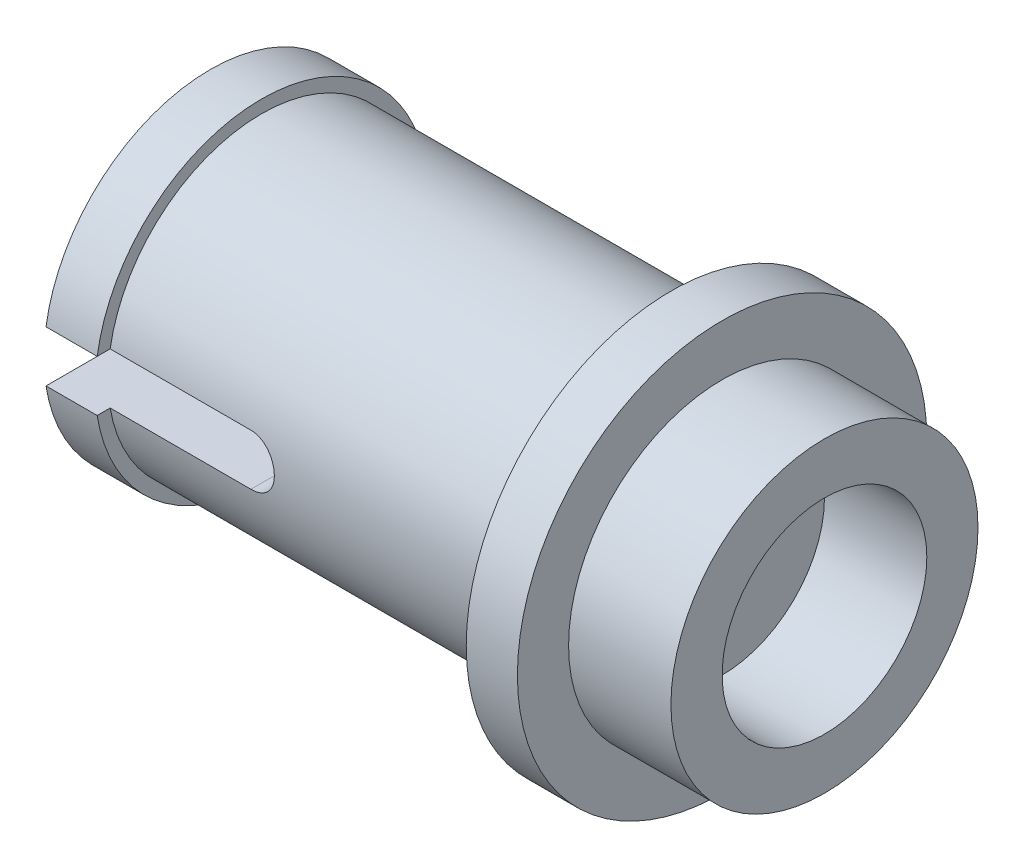
ISO-10303-21;
HEADER;
FILE_DESCRIPTION(('STEP AP214'),'2;1');
FILE_NAME('part.step','',(''),(''),'','','');
FILE_SCHEMA(('AUTOMOTIVE_DESIGN { 1 0 10303 214 1 1 1 1 }'));
ENDSEC;
DATA;
#1=APPLICATION_CONTEXT('core data for automotive mechanical design processes');
#2=APPLICATION_PROTOCOL_DEFINITION('international standard','automotive_design',2000,#1);
#3=PRODUCT_CONTEXT('',#1,'mechanical');
#4=PRODUCT('Part','Part','',(#3));
#5=PRODUCT_RELATED_PRODUCT_CATEGORY('part','',(#4));
#6=PRODUCT_DEFINITION_FORMATION('','',#4);
#7=PRODUCT_DEFINITION_CONTEXT('part definition',#1,'design');
#8=PRODUCT_DEFINITION('design','',#6,#7);
#9=PRODUCT_DEFINITION_SHAPE('','',#8);
#10=(LENGTH_UNIT() NAMED_UNIT(*) SI_UNIT(.MILLI.,.METRE.));
#11=(NAMED_UNIT(*) PLANE_ANGLE_UNIT() SI_UNIT($,.RADIAN.));
#12=(NAMED_UNIT(*) SI_UNIT($,.STERADIAN.) SOLID_ANGLE_UNIT());
#13=UNCERTAINTY_MEASURE_WITH_UNIT(LENGTH_MEASURE(1.E-05),#10,'distance_accuracy_value','');
#14=(GEOMETRIC_REPRESENTATION_CONTEXT(3) GLOBAL_UNCERTAINTY_ASSIGNED_CONTEXT((#13)) GLOBAL_UNIT_ASSIGNED_CONTEXT((#10,
#11,#12)) REPRESENTATION_CONTEXT('',''));
#15=CARTESIAN_POINT('',(0.,0.,0.));
#16=DIRECTION('',(0.,0.,1.));
#17=DIRECTION('',(1.,0.,0.));
#18=AXIS2_PLACEMENT_3D('',#15,#16,#17);
#19=CARTESIAN_POINT('',(-5.,0.,-2.4));
#20=DIRECTION('',(0.,0.,-1.));
#21=DIRECTION('',(0.,1.,0.));
#22=AXIS2_PLACEMENT_3D('',#19,#20,#21);
#23=CYLINDRICAL_SURFACE('',#22,0.399999999999987);
#24=DIRECTION('',(0.,0.,-1.));
#25=VECTOR('',#24,1.);
#26=CARTESIAN_POINT('',(-5.,-0.399999999999987,-2.4));
#27=LINE('',#26,#25);
#28=CARTESIAN_POINT('',(-5.,-0.4,-2.36643191323985));
#29=VERTEX_POINT('',#28);
#30=CARTESIAN_POINT('',(-5.,-0.399999999999987,-1.54919333848297));
#31=VERTEX_POINT('',#30);
#32=EDGE_CURVE('E166',#29,#31,#27,.F.);
#33=ORIENTED_EDGE('',*,*,#32,.T.);
#34=CARTESIAN_POINT('',(-5.,-0.399999999999987,-1.54919333848297));
#35=CARTESIAN_POINT('',(-4.977870870275,-0.400020725145284,-1.54917447927299));
#36=CARTESIAN_POINT('',(-4.95575559657479,-0.398165058222307,-1.54966700473976));
#37=CARTESIAN_POINT('',(-4.91220809020917,-0.390863732477916,-1.55153171879857));
#38=CARTESIAN_POINT('',(-4.89077456144329,-0.385425373001612,-1.55290211866096));
#39=CARTESIAN_POINT('',(-4.8491529813856,-0.371120935407192,-1.5563803844088));
#40=CARTESIAN_POINT('',(-4.82896481325978,-0.362255179400517,-1.55848818099093));
#41=CARTESIAN_POINT('',(-4.79035465591017,-0.341365693958401,-1.56319688894988));
#42=CARTESIAN_POINT('',(-4.77193314209998,-0.32934111770913,-1.56579793250385));
#43=CARTESIAN_POINT('',(-4.73698265805114,-0.30219391479842,-1.57126495280179));
#44=CARTESIAN_POINT('',(-4.72049810201915,-0.28701494131114,-1.57413513816699));
#45=CARTESIAN_POINT('',(-4.69027910768055,-0.254110278403526,-1.57978044353759));
#46=CARTESIAN_POINT('',(-4.67654510897018,-0.23638418267637,-1.58255554828847));
#47=CARTESIAN_POINT('',(-4.65203561480776,-0.198582769002932,-1.58774472203709));
#48=CARTESIAN_POINT('',(-4.64130404574441,-0.178478138608316,-1.59015321682706));
#49=CARTESIAN_POINT('',(-4.62339010218415,-0.136681033863118,-1.59428938690185));
#50=CARTESIAN_POINT('',(-4.61620702918212,-0.114988872976617,-1.5960171961629));
#51=CARTESIAN_POINT('',(-4.60573640396477,-0.0710976440533519,-1.59856759952662));
#52=CARTESIAN_POINT('',(-4.60237293131889,-0.0489177289733709,-1.599407811473));
#53=CARTESIAN_POINT('',(-4.59939865109472,-0.00429311010046354,-1.60014975273545));
#54=CARTESIAN_POINT('',(-4.59978737184671,0.0181515600571418,-1.60005160000874));
#55=CARTESIAN_POINT('',(-4.60425198554887,0.0621409971441903,-1.59894094942876));
#56=CARTESIAN_POINT('',(-4.60824584665984,0.0836946806839838,-1.59794879470061));
#57=CARTESIAN_POINT('',(-4.61967547165307,0.125815484445689,-1.59518532255482));
#58=CARTESIAN_POINT('',(-4.62711138782196,0.146382560972767,-1.59341397066338));
#59=CARTESIAN_POINT('',(-4.64528051227381,0.186162914406605,-1.58925999104603));
#60=CARTESIAN_POINT('',(-4.65604295769498,0.205362251840189,-1.58687197531455));
#61=CARTESIAN_POINT('',(-4.68053725193156,0.241710652492704,-1.58174378216336));
#62=CARTESIAN_POINT('',(-4.69426954809949,0.258859406224523,-1.57900355171435));
#63=CARTESIAN_POINT('',(-4.72475156483439,0.291107755883783,-1.57338226411041));
#64=CARTESIAN_POINT('',(-4.74157265462151,0.306139641223987,-1.570499401983));
#65=CARTESIAN_POINT('',(-4.77753194676553,0.333187830072139,-1.56498467306375));
#66=CARTESIAN_POINT('',(-4.79667078129299,0.345203308089023,-1.56235287510179));
#67=CARTESIAN_POINT('',(-4.83685823914545,0.365921883721032,-1.55763125461749));
#68=CARTESIAN_POINT('',(-4.8579165860256,0.374606807184798,-1.55554442505394));
#69=CARTESIAN_POINT('',(-4.90124677143419,0.388280940769096,-1.55218823619173));
#70=CARTESIAN_POINT('',(-4.92351674207541,0.393275675690244,-1.55091765521244));
#71=CARTESIAN_POINT('',(-4.95498295229977,0.397561854058537,-1.54982116265981));
#72=CARTESIAN_POINT('',(-4.96396788128338,0.398476316385757,-1.54958609241031));
#73=CARTESIAN_POINT('',(-4.98196711596562,0.399694703079857,-1.54927224998899));
#74=CARTESIAN_POINT('',(-4.9909813503859,0.39999961524023,-1.54919322494399));
#75=CARTESIAN_POINT('',(-5.00000000000001,0.400000000000002,-1.54919333848316));
#76=B_SPLINE_CURVE_WITH_KNOTS('',3,(#34,#35,#36,#37,#38,#39,#40,#41,#42,#43,#44,#45,#46,#47,#48,
#49,#50,#51,#52,#53,#54,#55,#56,#57,#58,#59,#60,#61,#62,#63,#64,#65,#66,#67,#68,#69,#70,#71,#72,
#73,#74,#75),.UNSPECIFIED.,.F.,.F.,(4,2,2,2,2,2,2,2,2,2,2,2,2,2,2,2,2,2,2,2,4),(0.,
0.0662829711959835,0.132431313994249,0.198573441590971,0.264733318639485,0.332196087719973,
0.399669630164458,0.468084077141717,0.536485051678474,0.603501254810073,0.670509033775327,
0.736029510665872,0.80155288665212,0.867669366550272,0.933795812606079,1.00170504688693,
1.06963284547263,1.13792620937738,1.20611711887513,1.23320272360578,1.26024439964187),.UNSPECIFIED.);
#77=CARTESIAN_POINT('',(-5.,0.4,-1.54919333848297));
#78=VERTEX_POINT('',#77);
#79=EDGE_CURVE('E213',#31,#78,#76,.T.);
#80=ORIENTED_EDGE('',*,*,#79,.T.);
#81=DIRECTION('',(0.,0.,-1.));
#82=VECTOR('',#81,1.);
#83=CARTESIAN_POINT('',(-5.,0.399999999999987,-2.4));
#84=LINE('',#83,#82);
#85=CARTESIAN_POINT('',(-5.,0.399999999999987,-2.36643191323985));
#86=VERTEX_POINT('',#85);
#87=EDGE_CURVE('E56',#78,#86,#84,.T.);
#88=ORIENTED_EDGE('',*,*,#87,.T.);
#89=CARTESIAN_POINT('',(-5.,0.399999999999987,-2.36643191323985));
#90=CARTESIAN_POINT('',(-4.97766246906809,0.400019844082439,-2.36641954996123));
#91=CARTESIAN_POINT('',(-4.95533420898425,0.398130152029126,-2.36674785677556));
#92=CARTESIAN_POINT('',(-4.91134374081069,0.390682400590726,-2.36799339564509));
#93=CARTESIAN_POINT('',(-4.889680697545,0.385129155846957,-2.36890985470761));
#94=CARTESIAN_POINT('',(-4.84760171416967,0.370502678689787,-2.3712399877639));
#95=CARTESIAN_POINT('',(-4.82718604913076,0.361428673100861,-2.372653770966));
#96=CARTESIAN_POINT('',(-4.78816561728827,0.340030990371612,-2.37581486106324));
#97=CARTESIAN_POINT('',(-4.76956087405116,0.327707270948808,-2.37756217229787));
#98=CARTESIAN_POINT('',(-4.73451070788765,0.300030765805278,-2.38121340110576));
#99=CARTESIAN_POINT('',(-4.71808550882098,0.284652526464636,-2.38311855040322));
#100=CARTESIAN_POINT('',(-4.68803437297396,0.25135717980182,-2.38685981376639));
#101=CARTESIAN_POINT('',(-4.67440886532615,0.233439683976316,-2.38869591721367));
#102=CARTESIAN_POINT('',(-4.65026931869679,0.195443122838853,-2.39210522316561));
#103=CARTESIAN_POINT('',(-4.6397742791164,0.175351828259583,-2.39367679607774));
#104=CARTESIAN_POINT('',(-4.62231623227297,0.133662065671763,-2.39636604440383));
#105=CARTESIAN_POINT('',(-4.61535279469557,0.112063781650036,-2.39748377511369));
#106=CARTESIAN_POINT('',(-4.60521725435486,0.0681832572805493,-2.39913076539991));
#107=CARTESIAN_POINT('',(-4.60201080943326,0.0459091525471305,-2.3996653522533));
#108=CARTESIAN_POINT('',(-4.5993734661388,0.00113258107106688,-2.4001041292235));
#109=CARTESIAN_POINT('',(-4.59994240068916,-0.0213698755220221,-2.40000834723684));
#110=CARTESIAN_POINT('',(-4.60481302381328,-0.0657284206244416,-2.39920137213474));
#111=CARTESIAN_POINT('',(-4.60907765300832,-0.087588705355261,-2.39849628911423));
#112=CARTESIAN_POINT('',(-4.62116022233349,-0.130278849466692,-2.39655675841517));
#113=CARTESIAN_POINT('',(-4.62897824802877,-0.151108684020854,-2.39532229798935));
#114=CARTESIAN_POINT('',(-4.64798267768401,-0.191257359514665,-2.39245228993513));
#115=CARTESIAN_POINT('',(-4.65918441163449,-0.210568808669898,-2.39081492332274));
#116=CARTESIAN_POINT('',(-4.6846265914774,-0.247051121369132,-2.38732111491997));
#117=CARTESIAN_POINT('',(-4.69886717033762,-0.264221891193402,-2.38546466354489));
#118=CARTESIAN_POINT('',(-4.73018640557625,-0.296153207933916,-2.38171267703782));
#119=CARTESIAN_POINT('',(-4.74729709687774,-0.310882327203917,-2.37981694029274));
#120=CARTESIAN_POINT('',(-4.78376869049262,-0.337269432960751,-2.37622125301939));
#121=CARTESIAN_POINT('',(-4.80313023210798,-0.348926543828297,-2.37452135838985));
#122=CARTESIAN_POINT('',(-4.84359657267141,-0.368846436960905,-2.37150876666683));
#123=CARTESIAN_POINT('',(-4.86470426154231,-0.377103451324983,-2.37019672858534));
#124=CARTESIAN_POINT('',(-4.90800892276512,-0.389930256051685,-2.36812146378402));
#125=CARTESIAN_POINT('',(-4.93020421354245,-0.394505559171055,-2.36735741672499));
#126=CARTESIAN_POINT('',(-4.96834398507896,-0.399062855336187,-2.36658965160523));
#127=CARTESIAN_POINT('',(-4.98417513227373,-0.40000869340609,-2.36642698637577));
#128=CARTESIAN_POINT('',(-5.,-0.399999999999987,-2.36643191323985));
#129=B_SPLINE_CURVE_WITH_KNOTS('',3,(#89,#90,#91,#92,#93,#94,#95,#96,#97,#98,#99,#100,#101,#102,
#103,#104,#105,#106,#107,#108,#109,#110,#111,#112,#113,#114,#115,#116,#117,#118,#119,#120,#121,
#122,#123,#124,#125,#126,#127,#128),.UNSPECIFIED.,.F.,.F.,(4,2,2,2,2,2,2,2,2,2,2,2,2,2,2,2,2,2,
2,4),(0.,0.06691648422822,0.133745201526226,0.200588603036549,0.267432874298614,
0.334859486952561,0.4022964269606,0.47013469474451,0.537964694666209,0.605169709342186,
0.672371749927004,0.73890760447332,0.805445061276012,0.872288608141026,0.939135080414253,
1.00678447723076,1.07445313545453,1.14223611807578,1.20991741698735,1.25738087156548),.UNSPECIFIED.);
#130=EDGE_CURVE('E175',#86,#29,#129,.T.);
#131=ORIENTED_EDGE('',*,*,#130,.T.);
#132=EDGE_LOOP('',(#33,#80,#88,#131));
#133=FACE_BOUND('',#132,.T.);
#134=ADVANCED_FACE('F33',(#133),#23,.F.);
#135=CARTESIAN_POINT('',(-8.,-0.4,-2.56904651573303));
#136=DIRECTION('',(0.,-1.,0.));
#137=DIRECTION('',(1.,0.,0.));
#138=AXIS2_PLACEMENT_3D('',#135,#136,#137);
#139=PLANE('',#138);
#140=CARTESIAN_POINT('',(-5.,-0.399999999999986,1.54919333848297));
#141=VERTEX_POINT('',#140);
#142=CARTESIAN_POINT('',(-5.,-0.4,2.36643191323985));
#143=VERTEX_POINT('',#142);
#144=EDGE_CURVE('E142',#141,#143,#27,.F.);
#145=ORIENTED_EDGE('',*,*,#144,.F.);
#146=DIRECTION('',(-1.,0.,0.));
#147=VECTOR('',#146,1.);
#148=CARTESIAN_POINT('',(-0.799999999999999,-0.4,1.54919333848297));
#149=LINE('',#148,#147);
#150=CARTESIAN_POINT('',(-8.,-0.4,1.54919333848297));
#151=VERTEX_POINT('',#150);
#152=EDGE_CURVE('E125',#141,#151,#149,.T.);
#153=ORIENTED_EDGE('',*,*,#152,.T.);
#154=DIRECTION('',(0.,0.,-1.));
#155=VECTOR('',#154,1.);
#156=CARTESIAN_POINT('',(-8.,-0.4,-2.56904651573303));
#157=LINE('',#156,#155);
#158=CARTESIAN_POINT('',(-8.,-0.4,2.56904651573303));
#159=VERTEX_POINT('',#158);
#160=EDGE_CURVE('E139',#159,#151,#157,.T.);
#161=ORIENTED_EDGE('',*,*,#160,.F.);
#162=DIRECTION('',(1.,0.,0.));
#163=VECTOR('',#162,1.);
#164=CARTESIAN_POINT('',(-8.,-0.4,2.56904651573303));
#165=LINE('',#164,#163);
#166=CARTESIAN_POINT('',(-7.2,-0.4,2.56904651573303));
#167=VERTEX_POINT('',#166);
#168=EDGE_CURVE('E154',#159,#167,#165,.T.);
#169=ORIENTED_EDGE('',*,*,#168,.T.);
#170=DIRECTION('',(0.,0.,1.));
#171=VECTOR('',#170,1.);
#172=CARTESIAN_POINT('',(-7.2,-0.4,2.36643191323985));
#173=LINE('',#172,#171);
#174=CARTESIAN_POINT('',(-7.2,-0.4,2.36643191323985));
#175=VERTEX_POINT('',#174);
#176=EDGE_CURVE('E253',#175,#167,#173,.T.);
#177=ORIENTED_EDGE('',*,*,#176,.F.);
#178=DIRECTION('',(1.,0.,0.));
#179=VECTOR('',#178,1.);
#180=CARTESIAN_POINT('',(-7.2,-0.4,2.36643191323985));
#181=LINE('',#180,#179);
#182=EDGE_CURVE('E260',#175,#143,#181,.T.);
#183=ORIENTED_EDGE('',*,*,#182,.T.);
#184=EDGE_LOOP('',(#145,#153,#161,#169,#177,#183));
#185=FACE_BOUND('',#184,.T.);
#186=ADVANCED_FACE('F137',(#185),#139,.F.);
#187=CARTESIAN_POINT('',(-7.2,0.4,2.36643191323985));
#188=DIRECTION('',(0.,1.,0.));
#189=DIRECTION('',(-1.,0.,0.));
#190=AXIS2_PLACEMENT_3D('',#187,#188,#189);
#191=PLANE('',#190);
#192=ORIENTED_EDGE('',*,*,#87,.F.);
#193=DIRECTION('',(-1.,0.,0.));
#194=VECTOR('',#193,1.);
#195=CARTESIAN_POINT('',(-0.799999999999999,0.4,-1.54919333848297));
#196=LINE('',#195,#194);
#197=CARTESIAN_POINT('',(-8.,0.4,-1.54919333848297));
#198=VERTEX_POINT('',#197);
#199=EDGE_CURVE('E143',#78,#198,#196,.T.);
#200=ORIENTED_EDGE('',*,*,#199,.T.);
#201=DIRECTION('',(0.,0.,1.));
#202=VECTOR('',#201,1.);
#203=CARTESIAN_POINT('',(-8.,0.4,2.56904651573303));
#204=LINE('',#203,#202);
#205=CARTESIAN_POINT('',(-8.,0.4,-2.56904651573303));
#206=VERTEX_POINT('',#205);
#207=EDGE_CURVE('E228',#206,#198,#204,.T.);
#208=ORIENTED_EDGE('',*,*,#207,.F.);
#209=DIRECTION('',(1.,0.,0.));
#210=VECTOR('',#209,1.);
#211=CARTESIAN_POINT('',(-8.,0.4,-2.56904651573303));
#212=LINE('',#211,#210);
#213=CARTESIAN_POINT('',(-7.2,0.4,-2.56904651573303));
#214=VERTEX_POINT('',#213);
#215=EDGE_CURVE('E239',#206,#214,#212,.T.);
#216=ORIENTED_EDGE('',*,*,#215,.T.);
#217=DIRECTION('',(0.,0.,1.));
#218=VECTOR('',#217,1.);
#219=CARTESIAN_POINT('',(-7.2,0.4,2.56904651573303));
#220=LINE('',#219,#218);
#221=CARTESIAN_POINT('',(-7.2,0.4,-2.36643191323985));
#222=VERTEX_POINT('',#221);
#223=EDGE_CURVE('E227',#214,#222,#220,.T.);
#224=ORIENTED_EDGE('',*,*,#223,.T.);
#225=DIRECTION('',(1.,0.,0.));
#226=VECTOR('',#225,1.);
#227=CARTESIAN_POINT('',(-7.2,0.4,-2.36643191323985));
#228=LINE('',#227,#226);
#229=EDGE_CURVE('E248',#222,#86,#228,.T.);
#230=ORIENTED_EDGE('',*,*,#229,.T.);
#231=EDGE_LOOP('',(#192,#200,#208,#216,#224,#230));
#232=FACE_BOUND('',#231,.T.);
#233=ADVANCED_FACE('F297',(#232),#191,.F.);
#234=CARTESIAN_POINT('',(-5.,0.,0.));
#235=DIRECTION('',(1.,0.,0.));
#236=DIRECTION('',(0.,1.,0.));
#237=AXIS2_PLACEMENT_3D('',#234,#235,#236);
#238=CYLINDRICAL_SURFACE('',#237,2.4);
#239=CARTESIAN_POINT('',(-5.,-0.399999999999986,2.36643191323985));
#240=CARTESIAN_POINT('',(-4.97766246906809,-0.400019844082438,2.36641954996123));
#241=CARTESIAN_POINT('',(-4.95533420898425,-0.398130152029125,2.36674785677556));
#242=CARTESIAN_POINT('',(-4.91134374081069,-0.390682400590725,2.36799339564509));
#243=CARTESIAN_POINT('',(-4.889680697545,-0.385129155846957,2.36890985470761));
#244=CARTESIAN_POINT('',(-4.84760171416967,-0.370502678689786,2.3712399877639));
#245=CARTESIAN_POINT('',(-4.82718604913076,-0.36142867310086,2.372653770966));
#246=CARTESIAN_POINT('',(-4.78816561728827,-0.340030990371611,2.37581486106324));
#247=CARTESIAN_POINT('',(-4.76956087405116,-0.327707270948807,2.37756217229787));
#248=CARTESIAN_POINT('',(-4.73451070788765,-0.300030765805278,2.38121340110576));
#249=CARTESIAN_POINT('',(-4.71808550882098,-0.284652526464635,2.38311855040322));
#250=CARTESIAN_POINT('',(-4.68803437297396,-0.251357179801819,2.38685981376639));
#251=CARTESIAN_POINT('',(-4.67440886532615,-0.233439683976315,2.38869591721367));
#252=CARTESIAN_POINT('',(-4.65026931869679,-0.195443122838853,2.39210522316561));
#253=CARTESIAN_POINT('',(-4.6397742791164,-0.175351828259582,2.39367679607774));
#254=CARTESIAN_POINT('',(-4.62231623227297,-0.133662065671762,2.39636604440383));
#255=CARTESIAN_POINT('',(-4.61535279469557,-0.112063781650035,2.39748377511369));
#256=CARTESIAN_POINT('',(-4.60521725435486,-0.0681832572805485,2.39913076539991));
#257=CARTESIAN_POINT('',(-4.60201080943326,-0.0459091525471297,2.3996653522533));
#258=CARTESIAN_POINT('',(-4.5993734661388,-0.00113258107106606,2.4001041292235));
#259=CARTESIAN_POINT('',(-4.59994240068916,0.0213698755220229,2.40000834723684));
#260=CARTESIAN_POINT('',(-4.60481302381328,0.0657284206244423,2.39920137213474));
#261=CARTESIAN_POINT('',(-4.60907765300832,0.0875887053552617,2.39849628911423));
#262=CARTESIAN_POINT('',(-4.62116022233349,0.130278849466693,2.39655675841517));
#263=CARTESIAN_POINT('',(-4.62897824802877,0.151108684020855,2.39532229798935));
#264=CARTESIAN_POINT('',(-4.64798267768401,0.191257359514666,2.39245228993513));
#265=CARTESIAN_POINT('',(-4.65918441163449,0.210568808669899,2.39081492332274));
#266=CARTESIAN_POINT('',(-4.6846265914774,0.247051121369133,2.38732111491997));
#267=CARTESIAN_POINT('',(-4.69886717033762,0.264221891193403,2.38546466354489));
#268=CARTESIAN_POINT('',(-4.73018640557625,0.296153207933916,2.38171267703782));
#269=CARTESIAN_POINT('',(-4.74729709687774,0.310882327203917,2.37981694029274));
#270=CARTESIAN_POINT('',(-4.78376869049262,0.337269432960751,2.37622125301939));
#271=CARTESIAN_POINT('',(-4.80313023210798,0.348926543828298,2.37452135838985));
#272=CARTESIAN_POINT('',(-4.84359657267141,0.368846436960906,2.37150876666683));
#273=CARTESIAN_POINT('',(-4.86470426154231,0.377103451324984,2.37019672858534));
#274=CARTESIAN_POINT('',(-4.90800892276511,0.389930256051685,2.36812146378402));
#275=CARTESIAN_POINT('',(-4.93020421354245,0.394505559171056,2.36735741672499));
#276=CARTESIAN_POINT('',(-4.96834398507896,0.399062855336188,2.36658965160523));
#277=CARTESIAN_POINT('',(-4.98417513227373,0.40000869340609,2.36642698637577));
#278=CARTESIAN_POINT('',(-5.,0.399999999999988,2.36643191323985));
#279=B_SPLINE_CURVE_WITH_KNOTS('',3,(#239,#240,#241,#242,#243,#244,#245,#246,#247,#248,#249,
#250,#251,#252,#253,#254,#255,#256,#257,#258,#259,#260,#261,#262,#263,#264,#265,#266,#267,#268,
#269,#270,#271,#272,#273,#274,#275,#276,#277,#278),.UNSPECIFIED.,.F.,.F.,(4,2,2,2,2,2,2,2,2,2,2,
2,2,2,2,2,2,2,2,4),(0.,0.0669164842282191,0.133745201526226,0.200588603036548,0.267432874298614,
0.33485948695256,0.4022964269606,0.47013469474451,0.537964694666209,0.605169709342186,
0.672371749927004,0.73890760447332,0.805445061276011,0.872288608141026,0.939135080414253,
1.00678447723075,1.07445313545453,1.14223611807578,1.20991741698735,1.25738087156548),.UNSPECIFIED.);
#280=CARTESIAN_POINT('',(-5.,0.4,2.36643191323985));
#281=VERTEX_POINT('',#280);
#282=EDGE_CURVE('E180',#143,#281,#279,.T.);
#283=ORIENTED_EDGE('',*,*,#282,.F.);
#284=ORIENTED_EDGE('',*,*,#182,.F.);
#285=CARTESIAN_POINT('',(-7.2,0.,0.));
#286=DIRECTION('',(-1.,0.,0.));
#287=DIRECTION('',(0.,-1.,0.));
#288=AXIS2_PLACEMENT_3D('',#285,#286,#287);
#289=CIRCLE('',#288,2.4);
#290=CARTESIAN_POINT('',(-7.2,-0.4,-2.36643191323985));
#291=VERTEX_POINT('',#290);
#292=EDGE_CURVE('E250',#291,#175,#289,.T.);
#293=ORIENTED_EDGE('',*,*,#292,.F.);
#294=DIRECTION('',(1.,0.,0.));
#295=VECTOR('',#294,1.);
#296=CARTESIAN_POINT('',(-7.2,-0.4,-2.36643191323985));
#297=LINE('',#296,#295);
#298=EDGE_CURVE('E261',#291,#29,#297,.T.);
#299=ORIENTED_EDGE('',*,*,#298,.T.);
#300=ORIENTED_EDGE('',*,*,#130,.F.);
#301=ORIENTED_EDGE('',*,*,#229,.F.);
#302=CARTESIAN_POINT('',(-7.2,0.,0.));
#303=DIRECTION('',(-1.,0.,0.));
#304=DIRECTION('',(0.,1.,0.));
#305=AXIS2_PLACEMENT_3D('',#302,#303,#304);
#306=CIRCLE('',#305,2.4);
#307=CARTESIAN_POINT('',(-7.2,0.4,2.36643191323985));
#308=VERTEX_POINT('',#307);
#309=EDGE_CURVE('E242',#308,#222,#306,.T.);
#310=ORIENTED_EDGE('',*,*,#309,.F.);
#311=DIRECTION('',(1.,0.,0.));
#312=VECTOR('',#311,1.);
#313=CARTESIAN_POINT('',(-7.2,0.4,2.36643191323985));
#314=LINE('',#313,#312);
#315=EDGE_CURVE('E245',#308,#281,#314,.T.);
#316=ORIENTED_EDGE('',*,*,#315,.T.);
#317=EDGE_LOOP('',(#283,#284,#293,#299,#300,#301,#310,#316));
#318=FACE_BOUND('',#317,.T.);
#319=CARTESIAN_POINT('',(-0.8,0.,0.));
#320=DIRECTION('',(1.,0.,0.));
#321=DIRECTION('',(0.,1.,0.));
#322=AXIS2_PLACEMENT_3D('',#319,#320,#321);
#323=CIRCLE('',#322,2.4);
#324=CARTESIAN_POINT('',(-0.800000000000001,2.4,0.));
#325=VERTEX_POINT('',#324);
#326=EDGE_CURVE('E172',#325,#325,#323,.T.);
#327=ORIENTED_EDGE('',*,*,#326,.F.);
#328=EDGE_LOOP('',(#327));
#329=FACE_BOUND('',#328,.T.);
#330=ADVANCED_FACE('F35',(#318,#329),#238,.T.);
#331=CARTESIAN_POINT('',(-5.,0.4,1.54919333848297));
#332=VERTEX_POINT('',#331);
#333=EDGE_CURVE('E169',#281,#332,#84,.T.);
#334=ORIENTED_EDGE('',*,*,#333,.T.);
#335=CARTESIAN_POINT('',(-5.,0.399999999999988,1.54919333848297));
#336=CARTESIAN_POINT('',(-4.977870870275,0.400020725145285,1.54917447927299));
#337=CARTESIAN_POINT('',(-4.95575559657479,0.398165058222307,1.54966700473976));
#338=CARTESIAN_POINT('',(-4.91220809020917,0.390863732477917,1.55153171879857));
#339=CARTESIAN_POINT('',(-4.89077456144329,0.385425373001613,1.55290211866096));
#340=CARTESIAN_POINT('',(-4.8491529813856,0.371120935407193,1.5563803844088));
#341=CARTESIAN_POINT('',(-4.82896481325978,0.362255179400518,1.55848818099093));
#342=CARTESIAN_POINT('',(-4.79035465591017,0.341365693958402,1.56319688894988));
#343=CARTESIAN_POINT('',(-4.77193314209998,0.329341117709131,1.56579793250385));
#344=CARTESIAN_POINT('',(-4.73698265805114,0.302193914798421,1.57126495280179));
#345=CARTESIAN_POINT('',(-4.72049810201915,0.287014941311142,1.57413513816699));
#346=CARTESIAN_POINT('',(-4.69027910768055,0.254110278403528,1.57978044353759));
#347=CARTESIAN_POINT('',(-4.67654510897018,0.236384182676373,1.58255554828847));
#348=CARTESIAN_POINT('',(-4.65203561480776,0.198582769002934,1.58774472203709));
#349=CARTESIAN_POINT('',(-4.64130404574441,0.178478138608317,1.59015321682706));
#350=CARTESIAN_POINT('',(-4.62339010218415,0.13668103386312,1.59428938690185));
#351=CARTESIAN_POINT('',(-4.61620702918212,0.114988872976619,1.5960171961629));
#352=CARTESIAN_POINT('',(-4.60573640396477,0.0710976440533539,1.59856759952662));
#353=CARTESIAN_POINT('',(-4.60237293131889,0.0489177289733728,1.599407811473));
#354=CARTESIAN_POINT('',(-4.59939865109472,0.00429311010046539,1.60014975273545));
#355=CARTESIAN_POINT('',(-4.59978737184671,-0.01815156005714,1.60005160000874));
#356=CARTESIAN_POINT('',(-4.60425198554887,-0.0621409971441883,1.59894094942876));
#357=CARTESIAN_POINT('',(-4.60824584665984,-0.0836946806839819,1.59794879470061));
#358=CARTESIAN_POINT('',(-4.61967547165307,-0.125815484445687,1.59518532255482));
#359=CARTESIAN_POINT('',(-4.62711138782196,-0.146382560972766,1.59341397066338));
#360=CARTESIAN_POINT('',(-4.64528051227381,-0.186162914406603,1.58925999104603));
#361=CARTESIAN_POINT('',(-4.65604295769498,-0.205362251840186,1.58687197531455));
#362=CARTESIAN_POINT('',(-4.68053725193156,-0.241710652492702,1.58174378216336));
#363=CARTESIAN_POINT('',(-4.69426954809949,-0.258859406224521,1.57900355171435));
#364=CARTESIAN_POINT('',(-4.72475156483438,-0.291107755883781,1.57338226411041));
#365=CARTESIAN_POINT('',(-4.74157265462151,-0.306139641223986,1.570499401983));
#366=CARTESIAN_POINT('',(-4.77753194676553,-0.333187830072137,1.56498467306375));
#367=CARTESIAN_POINT('',(-4.79667078129298,-0.345203308089022,1.56235287510179));
#368=CARTESIAN_POINT('',(-4.83685823914545,-0.365921883721031,1.55763125461749));
#369=CARTESIAN_POINT('',(-4.8579165860256,-0.374606807184797,1.55554442505394));
#370=CARTESIAN_POINT('',(-4.90124677143419,-0.388280940769095,1.55218823619173));
#371=CARTESIAN_POINT('',(-4.92351674207541,-0.393275675690243,1.55091765521244));
#372=CARTESIAN_POINT('',(-4.95498295229977,-0.397561854058536,1.54982116265981));
#373=CARTESIAN_POINT('',(-4.96396788128338,-0.398476316385756,1.54958609241031));
#374=CARTESIAN_POINT('',(-4.98196711596562,-0.399694703079856,1.54927224998899));
#375=CARTESIAN_POINT('',(-4.9909813503859,-0.399999615240229,1.54919322494399));
#376=CARTESIAN_POINT('',(-5.00000000000001,-0.400000000000001,1.54919333848316));
#377=B_SPLINE_CURVE_WITH_KNOTS('',3,(#335,#336,#337,#338,#339,#340,#341,#342,#343,#344,#345,
#346,#347,#348,#349,#350,#351,#352,#353,#354,#355,#356,#357,#358,#359,#360,#361,#362,#363,#364,
#365,#366,#367,#368,#369,#370,#371,#372,#373,#374,#375,#376),.UNSPECIFIED.,.F.,.F.,(4,2,2,2,2,2,
2,2,2,2,2,2,2,2,2,2,2,2,2,2,4),(0.,0.0662829711959835,0.132431313994248,0.198573441590971,
0.264733318639484,0.332196087719971,0.399669630164457,0.468084077141716,0.536485051678473,
0.603501254810072,0.670509033775326,0.736029510665871,0.801552886652119,0.86766936655027,
0.933795812606078,1.00170504688693,1.06963284547263,1.13792620937738,1.20611711887513,
1.23320272360578,1.26024439964187),.UNSPECIFIED.);
#378=EDGE_CURVE('E144',#332,#141,#377,.T.);
#379=ORIENTED_EDGE('',*,*,#378,.T.);
#380=ORIENTED_EDGE('',*,*,#144,.T.);
#381=ORIENTED_EDGE('',*,*,#282,.T.);
#382=EDGE_LOOP('',(#334,#379,#380,#381));
#383=FACE_BOUND('',#382,.T.);
#384=ADVANCED_FACE('F184',(#383),#23,.F.);
#385=CARTESIAN_POINT('',(0.,0.,0.));
#386=DIRECTION('',(-1.,0.,0.));
#387=DIRECTION('',(0.,0.,1.));
#388=AXIS2_PLACEMENT_3D('',#385,#386,#387);
#389=CYLINDRICAL_SURFACE('',#388,3.2);
#390=CARTESIAN_POINT('',(0.,0.,0.));
#391=DIRECTION('',(-1.,0.,0.));
#392=DIRECTION('',(0.,0.,1.));
#393=AXIS2_PLACEMENT_3D('',#390,#391,#392);
#394=CIRCLE('',#393,3.2);
#395=CARTESIAN_POINT('',(0.,0.,3.2));
#396=VERTEX_POINT('',#395);
#397=EDGE_CURVE('E161',#396,#396,#394,.T.);
#398=ORIENTED_EDGE('',*,*,#397,.T.);
#399=EDGE_LOOP('',(#398));
#400=FACE_BOUND('',#399,.T.);
#401=CARTESIAN_POINT('',(-0.8,0.,0.));
#402=DIRECTION('',(-1.,0.,0.));
#403=DIRECTION('',(0.,0.,1.));
#404=AXIS2_PLACEMENT_3D('',#401,#402,#403);
#405=CIRCLE('',#404,3.2);
#406=CARTESIAN_POINT('',(-0.8,0.,3.2));
#407=VERTEX_POINT('',#406);
#408=EDGE_CURVE('E160',#407,#407,#405,.T.);
#409=ORIENTED_EDGE('',*,*,#408,.F.);
#410=EDGE_LOOP('',(#409));
#411=FACE_BOUND('',#410,.T.);
#412=ADVANCED_FACE('F188',(#400,#411),#389,.T.);
#413=CARTESIAN_POINT('',(0.,0.,0.));
#414=DIRECTION('',(-1.,0.,0.));
#415=DIRECTION('',(0.,0.,1.));
#416=AXIS2_PLACEMENT_3D('',#413,#414,#415);
#417=PLANE('',#416);
#418=CARTESIAN_POINT('',(0.,0.,0.));
#419=DIRECTION('',(-1.,0.,0.));
#420=DIRECTION('',(0.,0.,1.));
#421=AXIS2_PLACEMENT_3D('',#418,#419,#420);
#422=CIRCLE('',#421,2.4);
#423=CARTESIAN_POINT('',(0.,0.,2.4));
#424=VERTEX_POINT('',#423);
#425=EDGE_CURVE('E42',#424,#424,#422,.F.);
#426=ORIENTED_EDGE('',*,*,#425,.F.);
#427=EDGE_LOOP('',(#426));
#428=FACE_BOUND('',#427,.T.);
#429=ORIENTED_EDGE('',*,*,#397,.F.);
#430=EDGE_LOOP('',(#429));
#431=FACE_BOUND('',#430,.T.);
#432=ADVANCED_FACE('F273',(#428,#431),#417,.F.);
#433=CARTESIAN_POINT('',(-0.8,0.,0.));
#434=DIRECTION('',(-1.,0.,0.));
#435=DIRECTION('',(0.,0.,1.));
#436=AXIS2_PLACEMENT_3D('',#433,#434,#435);
#437=PLANE('',#436);
#438=ORIENTED_EDGE('',*,*,#326,.T.);
#439=EDGE_LOOP('',(#438));
#440=FACE_BOUND('',#439,.T.);
#441=ORIENTED_EDGE('',*,*,#408,.T.);
#442=EDGE_LOOP('',(#441));
#443=FACE_BOUND('',#442,.T.);
#444=ADVANCED_FACE('F276',(#440,#443),#437,.T.);
#445=CARTESIAN_POINT('',(-8.,0.,0.));
#446=DIRECTION('',(1.,0.,0.));
#447=DIRECTION('',(0.,1.,0.));
#448=AXIS2_PLACEMENT_3D('',#445,#446,#447);
#449=CYLINDRICAL_SURFACE('',#448,2.6);
#450=DIRECTION('',(1.,0.,0.));
#451=VECTOR('',#450,1.);
#452=CARTESIAN_POINT('',(-8.,-0.4,-2.56904651573303));
#453=LINE('',#452,#451);
#454=CARTESIAN_POINT('',(-8.,-0.4,-2.56904651573303));
#455=VERTEX_POINT('',#454);
#456=CARTESIAN_POINT('',(-7.2,-0.4,-2.56904651573303));
#457=VERTEX_POINT('',#456);
#458=EDGE_CURVE('E150',#455,#457,#453,.T.);
#459=ORIENTED_EDGE('',*,*,#458,.T.);
#460=CARTESIAN_POINT('',(-7.2,0.,0.));
#461=DIRECTION('',(1.,0.,0.));
#462=DIRECTION('',(0.,1.,0.));
#463=AXIS2_PLACEMENT_3D('',#460,#461,#462);
#464=CIRCLE('',#463,2.6);
#465=EDGE_CURVE('E255',#167,#457,#464,.T.);
#466=ORIENTED_EDGE('',*,*,#465,.F.);
#467=ORIENTED_EDGE('',*,*,#168,.F.);
#468=CARTESIAN_POINT('',(-8.,0.,0.));
#469=DIRECTION('',(-1.,0.,0.));
#470=DIRECTION('',(0.,1.,0.));
#471=AXIS2_PLACEMENT_3D('',#468,#469,#470);
#472=CIRCLE('',#471,2.6);
#473=EDGE_CURVE('E148',#455,#159,#472,.T.);
#474=ORIENTED_EDGE('',*,*,#473,.F.);
#475=EDGE_LOOP('',(#459,#466,#467,#474));
#476=FACE_BOUND('',#475,.T.);
#477=ADVANCED_FACE('F285',(#476),#449,.T.);
#478=CARTESIAN_POINT('',(-8.,-0.4,-1.54919333848297));
#479=VERTEX_POINT('',#478);
#480=EDGE_CURVE('E151',#479,#455,#157,.T.);
#481=ORIENTED_EDGE('',*,*,#480,.F.);
#482=DIRECTION('',(-1.,0.,0.));
#483=VECTOR('',#482,1.);
#484=CARTESIAN_POINT('',(-0.799999999999999,-0.4,-1.54919333848297));
#485=LINE('',#484,#483);
#486=EDGE_CURVE('E128',#479,#31,#485,.F.);
#487=ORIENTED_EDGE('',*,*,#486,.T.);
#488=ORIENTED_EDGE('',*,*,#32,.F.);
#489=ORIENTED_EDGE('',*,*,#298,.F.);
#490=DIRECTION('',(0.,0.,1.));
#491=VECTOR('',#490,1.);
#492=CARTESIAN_POINT('',(-7.2,-0.4,-2.56904651573303));
#493=LINE('',#492,#491);
#494=EDGE_CURVE('E257',#457,#291,#493,.T.);
#495=ORIENTED_EDGE('',*,*,#494,.F.);
#496=ORIENTED_EDGE('',*,*,#458,.F.);
#497=EDGE_LOOP('',(#481,#487,#488,#489,#495,#496));
#498=FACE_BOUND('',#497,.T.);
#499=ADVANCED_FACE('F290',(#498),#139,.F.);
#500=CARTESIAN_POINT('',(-8.,0.,0.));
#501=DIRECTION('',(1.,0.,0.));
#502=DIRECTION('',(0.,1.,0.));
#503=AXIS2_PLACEMENT_3D('',#500,#501,#502);
#504=PLANE('',#503);
#505=ORIENTED_EDGE('',*,*,#160,.T.);
#506=CARTESIAN_POINT('',(-8.,0.,0.));
#507=DIRECTION('',(-1.,0.,0.));
#508=DIRECTION('',(0.,-1.,0.));
#509=AXIS2_PLACEMENT_3D('',#506,#507,#508);
#510=CIRCLE('',#509,1.6);
#511=EDGE_CURVE('E122',#479,#151,#510,.T.);
#512=ORIENTED_EDGE('',*,*,#511,.F.);
#513=ORIENTED_EDGE('',*,*,#480,.T.);
#514=ORIENTED_EDGE('',*,*,#473,.T.);
#515=EDGE_LOOP('',(#505,#512,#513,#514));
#516=FACE_BOUND('',#515,.T.);
#517=ADVANCED_FACE('F146',(#516),#504,.F.);
#518=CARTESIAN_POINT('',(-7.2,0.,0.));
#519=DIRECTION('',(-1.,0.,0.));
#520=DIRECTION('',(0.,-1.,0.));
#521=AXIS2_PLACEMENT_3D('',#518,#519,#520);
#522=PLANE('',#521);
#523=ORIENTED_EDGE('',*,*,#292,.T.);
#524=ORIENTED_EDGE('',*,*,#176,.T.);
#525=ORIENTED_EDGE('',*,*,#465,.T.);
#526=ORIENTED_EDGE('',*,*,#494,.T.);
#527=EDGE_LOOP('',(#523,#524,#525,#526));
#528=FACE_BOUND('',#527,.T.);
#529=ADVANCED_FACE('F307',(#528),#522,.F.);
#530=CARTESIAN_POINT('',(-8.,0.4,1.54919333848297));
#531=VERTEX_POINT('',#530);
#532=CARTESIAN_POINT('',(-8.,0.4,2.56904651573303));
#533=VERTEX_POINT('',#532);
#534=EDGE_CURVE('E226',#531,#533,#204,.T.);
#535=ORIENTED_EDGE('',*,*,#534,.F.);
#536=DIRECTION('',(-1.,0.,0.));
#537=VECTOR('',#536,1.);
#538=CARTESIAN_POINT('',(-0.799999999999999,0.4,1.54919333848297));
#539=LINE('',#538,#537);
#540=EDGE_CURVE('E49',#531,#332,#539,.F.);
#541=ORIENTED_EDGE('',*,*,#540,.T.);
#542=ORIENTED_EDGE('',*,*,#333,.F.);
#543=ORIENTED_EDGE('',*,*,#315,.F.);
#544=CARTESIAN_POINT('',(-7.2,0.4,2.56904651573303));
#545=VERTEX_POINT('',#544);
#546=EDGE_CURVE('E234',#308,#545,#220,.T.);
#547=ORIENTED_EDGE('',*,*,#546,.T.);
#548=DIRECTION('',(1.,0.,0.));
#549=VECTOR('',#548,1.);
#550=CARTESIAN_POINT('',(-8.,0.4,2.56904651573303));
#551=LINE('',#550,#549);
#552=EDGE_CURVE('E231',#533,#545,#551,.T.);
#553=ORIENTED_EDGE('',*,*,#552,.F.);
#554=EDGE_LOOP('',(#535,#541,#542,#543,#547,#553));
#555=FACE_BOUND('',#554,.T.);
#556=ADVANCED_FACE('F321',(#555),#191,.F.);
#557=CARTESIAN_POINT('',(-8.,0.,0.));
#558=DIRECTION('',(1.,0.,0.));
#559=DIRECTION('',(0.,1.,0.));
#560=AXIS2_PLACEMENT_3D('',#557,#558,#559);
#561=CYLINDRICAL_SURFACE('',#560,2.6);
#562=CARTESIAN_POINT('',(-7.2,0.,0.));
#563=DIRECTION('',(-1.,0.,0.));
#564=DIRECTION('',(0.,1.,0.));
#565=AXIS2_PLACEMENT_3D('',#562,#563,#564);
#566=CIRCLE('',#565,2.6);
#567=EDGE_CURVE('E222',#545,#214,#566,.T.);
#568=ORIENTED_EDGE('',*,*,#567,.T.);
#569=ORIENTED_EDGE('',*,*,#215,.F.);
#570=CARTESIAN_POINT('',(-8.,0.,0.));
#571=DIRECTION('',(-1.,0.,0.));
#572=DIRECTION('',(0.,1.,0.));
#573=AXIS2_PLACEMENT_3D('',#570,#571,#572);
#574=CIRCLE('',#573,2.6);
#575=EDGE_CURVE('E223',#533,#206,#574,.T.);
#576=ORIENTED_EDGE('',*,*,#575,.F.);
#577=ORIENTED_EDGE('',*,*,#552,.T.);
#578=EDGE_LOOP('',(#568,#569,#576,#577));
#579=FACE_BOUND('',#578,.T.);
#580=ADVANCED_FACE('F317',(#579),#561,.T.);
#581=CARTESIAN_POINT('',(-8.,0.,0.));
#582=DIRECTION('',(1.,0.,0.));
#583=DIRECTION('',(0.,1.,0.));
#584=AXIS2_PLACEMENT_3D('',#581,#582,#583);
#585=PLANE('',#584);
#586=ORIENTED_EDGE('',*,*,#207,.T.);
#587=CARTESIAN_POINT('',(-8.,0.,0.));
#588=DIRECTION('',(1.,0.,0.));
#589=DIRECTION('',(0.,1.,0.));
#590=AXIS2_PLACEMENT_3D('',#587,#588,#589);
#591=CIRCLE('',#590,1.6);
#592=EDGE_CURVE('E11',#198,#531,#591,.T.);
#593=ORIENTED_EDGE('',*,*,#592,.T.);
#594=ORIENTED_EDGE('',*,*,#534,.T.);
#595=ORIENTED_EDGE('',*,*,#575,.T.);
#596=EDGE_LOOP('',(#586,#593,#594,#595));
#597=FACE_BOUND('',#596,.T.);
#598=ADVANCED_FACE('F342',(#597),#585,.F.);
#599=CARTESIAN_POINT('',(-7.2,0.,0.));
#600=DIRECTION('',(1.,0.,0.));
#601=DIRECTION('',(0.,1.,0.));
#602=AXIS2_PLACEMENT_3D('',#599,#600,#601);
#603=PLANE('',#602);
#604=ORIENTED_EDGE('',*,*,#546,.F.);
#605=ORIENTED_EDGE('',*,*,#309,.T.);
#606=ORIENTED_EDGE('',*,*,#223,.F.);
#607=ORIENTED_EDGE('',*,*,#567,.F.);
#608=EDGE_LOOP('',(#604,#605,#606,#607));
#609=FACE_BOUND('',#608,.T.);
#610=ADVANCED_FACE('F311',(#609),#603,.T.);
#611=CARTESIAN_POINT('',(1.6,0.,0.));
#612=DIRECTION('',(-1.,0.,0.));
#613=DIRECTION('',(0.,0.,1.));
#614=AXIS2_PLACEMENT_3D('',#611,#612,#613);
#615=CYLINDRICAL_SURFACE('',#614,2.4);
#616=CARTESIAN_POINT('',(1.6,0.,0.));
#617=DIRECTION('',(1.,0.,0.));
#618=DIRECTION('',(0.,0.,-1.));
#619=AXIS2_PLACEMENT_3D('',#616,#617,#618);
#620=CIRCLE('',#619,2.4);
#621=CARTESIAN_POINT('',(1.6,0.,-2.4));
#622=VERTEX_POINT('',#621);
#623=EDGE_CURVE('E219',#622,#622,#620,.T.);
#624=ORIENTED_EDGE('',*,*,#623,.F.);
#625=EDGE_LOOP('',(#624));
#626=FACE_BOUND('',#625,.T.);
#627=ORIENTED_EDGE('',*,*,#425,.T.);
#628=EDGE_LOOP('',(#627));
#629=FACE_BOUND('',#628,.T.);
#630=ADVANCED_FACE('F271',(#626,#629),#615,.T.);
#631=CARTESIAN_POINT('',(1.6,0.,0.));
#632=DIRECTION('',(1.,0.,0.));
#633=DIRECTION('',(0.,0.,-1.));
#634=AXIS2_PLACEMENT_3D('',#631,#632,#633);
#635=PLANE('',#634);
#636=CARTESIAN_POINT('',(1.6,0.,0.));
#637=DIRECTION('',(1.,0.,0.));
#638=DIRECTION('',(0.,0.,-1.));
#639=AXIS2_PLACEMENT_3D('',#636,#637,#638);
#640=CIRCLE('',#639,1.59999999999999);
#641=CARTESIAN_POINT('',(1.6,0.,-1.59999999999999));
#642=VERTEX_POINT('',#641);
#643=EDGE_CURVE('E328',#642,#642,#640,.T.);
#644=ORIENTED_EDGE('',*,*,#643,.F.);
#645=EDGE_LOOP('',(#644));
#646=FACE_BOUND('',#645,.T.);
#647=ORIENTED_EDGE('',*,*,#623,.T.);
#648=EDGE_LOOP('',(#647));
#649=FACE_BOUND('',#648,.T.);
#650=ADVANCED_FACE('F208',(#646,#649),#635,.T.);
#651=CARTESIAN_POINT('',(-0.799999999999999,0.,0.));
#652=DIRECTION('',(-1.,0.,0.));
#653=DIRECTION('',(0.,-1.,0.));
#654=AXIS2_PLACEMENT_3D('',#651,#652,#653);
#655=CYLINDRICAL_SURFACE('',#654,1.6);
#656=CARTESIAN_POINT('',(-0.8,0.,0.));
#657=DIRECTION('',(-1.,0.,0.));
#658=DIRECTION('',(0.,-1.,0.));
#659=AXIS2_PLACEMENT_3D('',#656,#657,#658);
#660=CIRCLE('',#659,1.6);
#661=CARTESIAN_POINT('',(-0.8,-1.6,0.));
#662=VERTEX_POINT('',#661);
#663=EDGE_CURVE('E132',#662,#662,#660,.T.);
#664=ORIENTED_EDGE('',*,*,#663,.F.);
#665=EDGE_LOOP('',(#664));
#666=FACE_BOUND('',#665,.T.);
#667=ORIENTED_EDGE('',*,*,#511,.T.);
#668=ORIENTED_EDGE('',*,*,#152,.F.);
#669=ORIENTED_EDGE('',*,*,#378,.F.);
#670=ORIENTED_EDGE('',*,*,#540,.F.);
#671=ORIENTED_EDGE('',*,*,#592,.F.);
#672=ORIENTED_EDGE('',*,*,#199,.F.);
#673=ORIENTED_EDGE('',*,*,#79,.F.);
#674=ORIENTED_EDGE('',*,*,#486,.F.);
#675=EDGE_LOOP('',(#667,#668,#669,#670,#671,#672,#673,#674));
#676=FACE_BOUND('',#675,.T.);
#677=ADVANCED_FACE('F124',(#666,#676),#655,.F.);
#678=CARTESIAN_POINT('',(-0.8,1.6,0.));
#679=DIRECTION('',(1.,0.,0.));
#680=DIRECTION('',(0.,1.,0.));
#681=AXIS2_PLACEMENT_3D('',#678,#679,#680);
#682=PLANE('',#681);
#683=ORIENTED_EDGE('',*,*,#663,.T.);
#684=EDGE_LOOP('',(#683));
#685=FACE_BOUND('',#684,.T.);
#686=ADVANCED_FACE('F207',(#685),#682,.F.);
#687=CARTESIAN_POINT('',(0.,0.,0.));
#688=DIRECTION('',(-1.,0.,0.));
#689=DIRECTION('',(0.,0.,1.));
#690=AXIS2_PLACEMENT_3D('',#687,#688,#689);
#691=PLANE('',#690);
#692=CARTESIAN_POINT('',(0.,0.,0.));
#693=DIRECTION('',(1.,0.,0.));
#694=DIRECTION('',(0.,0.,-1.));
#695=AXIS2_PLACEMENT_3D('',#692,#693,#694);
#696=CIRCLE('',#695,1.59999999999999);
#697=CARTESIAN_POINT('',(0.,0.,-1.59999999999999));
#698=VERTEX_POINT('',#697);
#699=EDGE_CURVE('E133',#698,#698,#696,.T.);
#700=ORIENTED_EDGE('',*,*,#699,.T.);
#701=EDGE_LOOP('',(#700));
#702=FACE_BOUND('',#701,.T.);
#703=ADVANCED_FACE('F479',(#702),#691,.F.);
#704=CARTESIAN_POINT('',(1.6,0.,0.));
#705=DIRECTION('',(1.,0.,0.));
#706=DIRECTION('',(0.,0.,-1.));
#707=AXIS2_PLACEMENT_3D('',#704,#705,#706);
#708=CYLINDRICAL_SURFACE('',#707,1.59999999999999);
#709=ORIENTED_EDGE('',*,*,#699,.F.);
#710=EDGE_LOOP('',(#709));
#711=FACE_BOUND('',#710,.T.);
#712=ORIENTED_EDGE('',*,*,#643,.T.);
#713=EDGE_LOOP('',(#712));
#714=FACE_BOUND('',#713,.T.);
#715=ADVANCED_FACE('F332',(#711,#714),#708,.F.);
#716=CLOSED_SHELL('',(#134,#186,#233,#330,#384,#412,#432,#444,#477,#499,#517,#529,#556,#580,
#598,#610,#630,#650,#677,#686,#703,#715));
#717=MANIFOLD_SOLID_BREP('B2',#716);
#718=ADVANCED_BREP_SHAPE_REPRESENTATION('',(#18,#717),#14);
#719=SHAPE_DEFINITION_REPRESENTATION(#9,#718);
ENDSEC;
END-ISO-10303-21;
